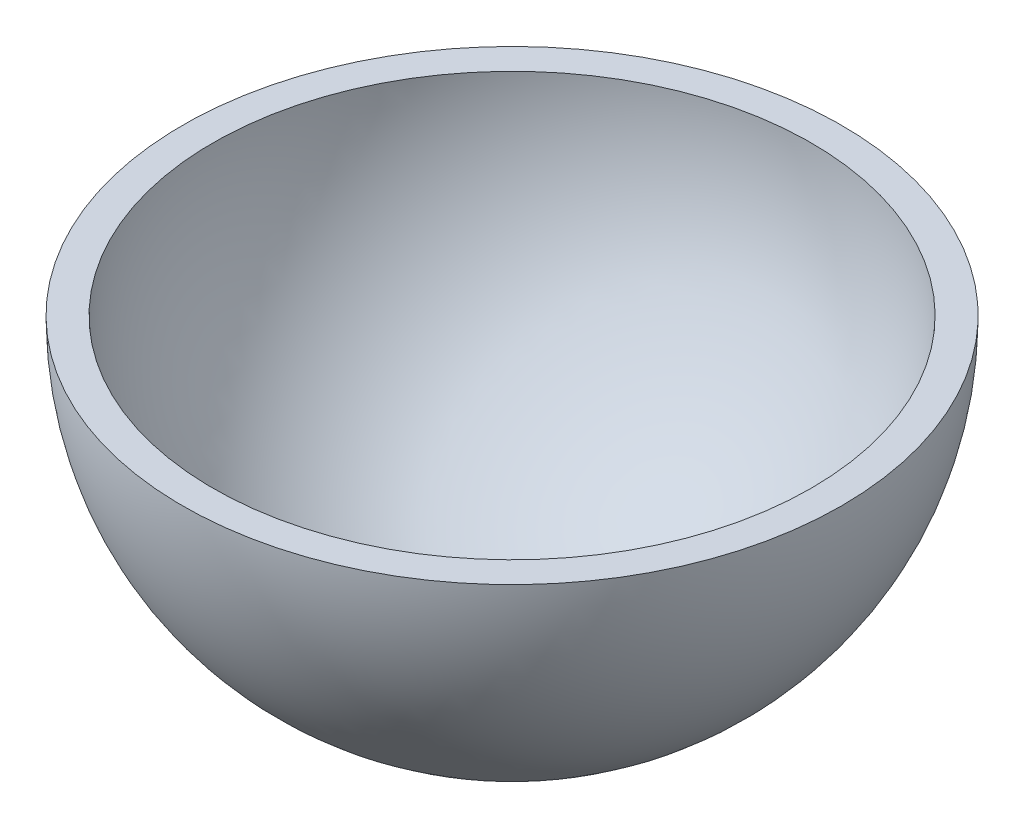
ISO-10303-21;
HEADER;
FILE_DESCRIPTION(('STEP AP214'),'2;1');
FILE_NAME('part.step','',(''),(''),'','','');
FILE_SCHEMA(('AUTOMOTIVE_DESIGN { 1 0 10303 214 1 1 1 1 }'));
ENDSEC;
DATA;
#1=APPLICATION_CONTEXT('core data for automotive mechanical design processes');
#2=APPLICATION_PROTOCOL_DEFINITION('international standard','automotive_design',2000,#1);
#3=PRODUCT_CONTEXT('',#1,'mechanical');
#4=PRODUCT('Part','Part','',(#3));
#5=PRODUCT_RELATED_PRODUCT_CATEGORY('part','',(#4));
#6=PRODUCT_DEFINITION_FORMATION('','',#4);
#7=PRODUCT_DEFINITION_CONTEXT('part definition',#1,'design');
#8=PRODUCT_DEFINITION('design','',#6,#7);
#9=PRODUCT_DEFINITION_SHAPE('','',#8);
#10=(LENGTH_UNIT() NAMED_UNIT(*) SI_UNIT(.MILLI.,.METRE.));
#11=(NAMED_UNIT(*) PLANE_ANGLE_UNIT() SI_UNIT($,.RADIAN.));
#12=(NAMED_UNIT(*) SI_UNIT($,.STERADIAN.) SOLID_ANGLE_UNIT());
#13=UNCERTAINTY_MEASURE_WITH_UNIT(LENGTH_MEASURE(1.E-05),#10,'distance_accuracy_value','');
#14=(GEOMETRIC_REPRESENTATION_CONTEXT(3) GLOBAL_UNCERTAINTY_ASSIGNED_CONTEXT((#13)) GLOBAL_UNIT_ASSIGNED_CONTEXT((#10,
#11,#12)) REPRESENTATION_CONTEXT('',''));
#15=CARTESIAN_POINT('',(0.,0.,0.));
#16=DIRECTION('',(0.,0.,1.));
#17=DIRECTION('',(1.,0.,0.));
#18=AXIS2_PLACEMENT_3D('',#15,#16,#17);
#19=CARTESIAN_POINT('',(-37.5,0.,-32.51));
#20=DIRECTION('',(0.,-1.,0.));
#21=DIRECTION('',(1.,0.,0.));
#22=AXIS2_PLACEMENT_3D('',#19,#20,#21);
#23=PLANE('',#22);
#24=CARTESIAN_POINT('',(0.,0.,0.));
#25=DIRECTION('',(0.,-1.,0.));
#26=DIRECTION('',(1.,0.,0.));
#27=AXIS2_PLACEMENT_3D('',#24,#25,#26);
#28=CIRCLE('',#27,29.5);
#29=CARTESIAN_POINT('',(29.5,0.,0.));
#30=VERTEX_POINT('',#29);
#31=EDGE_CURVE('E10',#30,#30,#28,.T.);
#32=ORIENTED_EDGE('',*,*,#31,.T.);
#33=EDGE_LOOP('',(#32));
#34=FACE_BOUND('',#33,.T.);
#35=CARTESIAN_POINT('',(0.,0.,0.));
#36=DIRECTION('',(0.,-1.,0.));
#37=DIRECTION('',(1.,0.,0.));
#38=AXIS2_PLACEMENT_3D('',#35,#36,#37);
#39=CIRCLE('',#38,32.5);
#40=CARTESIAN_POINT('',(32.5,0.,0.));
#41=VERTEX_POINT('',#40);
#42=EDGE_CURVE('E36',#41,#41,#39,.T.);
#43=ORIENTED_EDGE('',*,*,#42,.F.);
#44=EDGE_LOOP('',(#43));
#45=FACE_BOUND('',#44,.T.);
#46=ADVANCED_FACE('F33',(#34,#45),#23,.F.);
#47=CARTESIAN_POINT('',(0.,0.,0.));
#48=DIRECTION('',(0.,-1.,0.));
#49=DIRECTION('',(1.,0.,0.));
#50=AXIS2_PLACEMENT_3D('',#47,#48,#49);
#51=SPHERICAL_SURFACE('',#50,29.5);
#52=ORIENTED_EDGE('',*,*,#31,.F.);
#53=EDGE_LOOP('',(#52));
#54=FACE_BOUND('',#53,.T.);
#55=ADVANCED_FACE('F48',(#54),#51,.F.);
#56=CARTESIAN_POINT('',(0.,0.,0.));
#57=DIRECTION('',(0.,-1.,0.));
#58=DIRECTION('',(1.,0.,0.));
#59=AXIS2_PLACEMENT_3D('',#56,#57,#58);
#60=SPHERICAL_SURFACE('',#59,32.5);
#61=ORIENTED_EDGE('',*,*,#42,.T.);
#62=EDGE_LOOP('',(#61));
#63=FACE_BOUND('',#62,.T.);
#64=ADVANCED_FACE('F45',(#63),#60,.T.);
#65=CLOSED_SHELL('',(#46,#55,#64));
#66=MANIFOLD_SOLID_BREP('B2',#65);
#67=ADVANCED_BREP_SHAPE_REPRESENTATION('',(#18,#66),#14);
#68=SHAPE_DEFINITION_REPRESENTATION(#9,#67);
ENDSEC;
END-ISO-10303-21;
